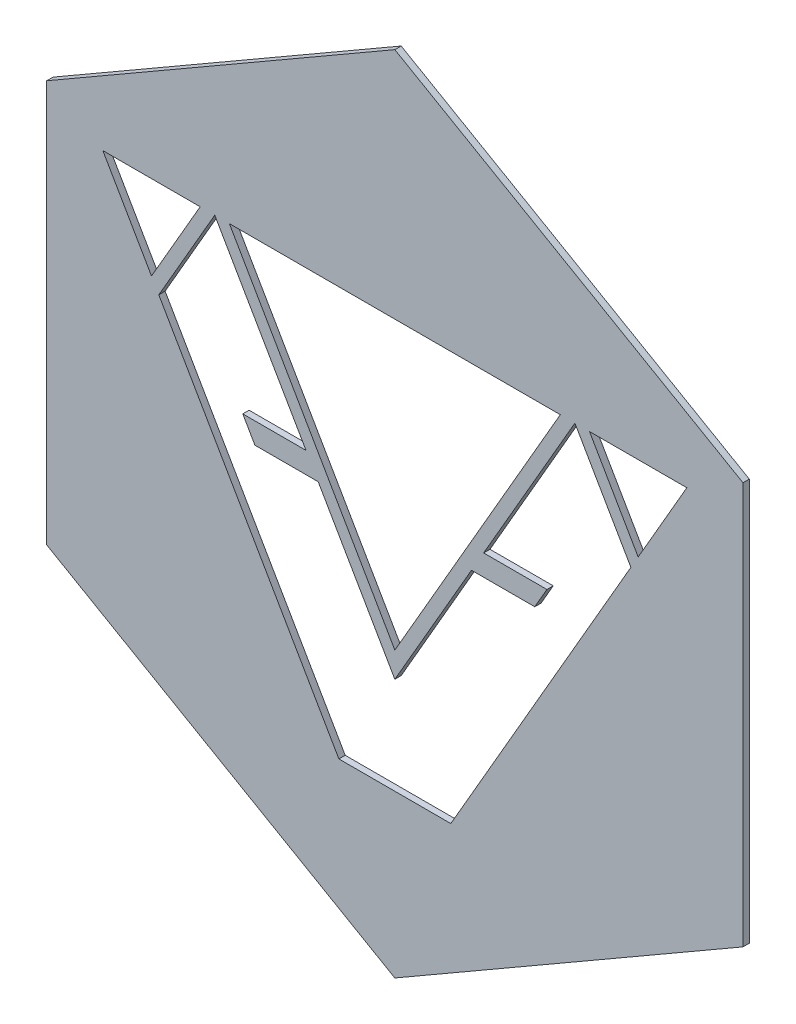
ISO-10303-21;
HEADER;
FILE_DESCRIPTION(('STEP AP214'),'2;1');
FILE_NAME('part.step','',(''),(''),'','','');
FILE_SCHEMA(('AUTOMOTIVE_DESIGN { 1 0 10303 214 1 1 1 1 }'));
ENDSEC;
DATA;
#1=APPLICATION_CONTEXT('core data for automotive mechanical design processes');
#2=APPLICATION_PROTOCOL_DEFINITION('international standard','automotive_design',2000,#1);
#3=PRODUCT_CONTEXT('',#1,'mechanical');
#4=PRODUCT('Part','Part','',(#3));
#5=PRODUCT_RELATED_PRODUCT_CATEGORY('part','',(#4));
#6=PRODUCT_DEFINITION_FORMATION('','',#4);
#7=PRODUCT_DEFINITION_CONTEXT('part definition',#1,'design');
#8=PRODUCT_DEFINITION('design','',#6,#7);
#9=PRODUCT_DEFINITION_SHAPE('','',#8);
#10=(LENGTH_UNIT() NAMED_UNIT(*) SI_UNIT(.MILLI.,.METRE.));
#11=(NAMED_UNIT(*) PLANE_ANGLE_UNIT() SI_UNIT($,.RADIAN.));
#12=(NAMED_UNIT(*) SI_UNIT($,.STERADIAN.) SOLID_ANGLE_UNIT());
#13=UNCERTAINTY_MEASURE_WITH_UNIT(LENGTH_MEASURE(1.E-05),#10,'distance_accuracy_value','');
#14=(GEOMETRIC_REPRESENTATION_CONTEXT(3) GLOBAL_UNCERTAINTY_ASSIGNED_CONTEXT((#13)) GLOBAL_UNIT_ASSIGNED_CONTEXT((#10,
#11,#12)) REPRESENTATION_CONTEXT('',''));
#15=CARTESIAN_POINT('',(0.,0.,0.));
#16=DIRECTION('',(0.,0.,1.));
#17=DIRECTION('',(1.,0.,0.));
#18=AXIS2_PLACEMENT_3D('',#15,#16,#17);
#19=CARTESIAN_POINT('',(0.,0.,0.));
#20=DIRECTION('',(0.,0.,1.));
#21=DIRECTION('',(1.,0.,0.));
#22=AXIS2_PLACEMENT_3D('',#19,#20,#21);
#23=PLANE('',#22);
#24=DIRECTION('',(0.5,-0.866025403784439,0.));
#25=VECTOR('',#24,1.);
#26=CARTESIAN_POINT('',(-13.0866061016315,13.3333333333333,0.));
#27=LINE('',#26,#25);
#28=CARTESIAN_POINT('',(-13.0866061016315,13.3333333333333,0.));
#29=VERTEX_POINT('',#28);
#30=CARTESIAN_POINT('',(0.,-9.33333333333341,0.));
#31=VERTEX_POINT('',#30);
#32=EDGE_CURVE('E471',#29,#31,#27,.T.);
#33=ORIENTED_EDGE('',*,*,#32,.T.);
#34=DIRECTION('',(0.5,0.866025403784438,0.));
#35=VECTOR('',#34,1.);
#36=CARTESIAN_POINT('',(0.,-9.33333333333341,0.));
#37=LINE('',#36,#35);
#38=CARTESIAN_POINT('',(13.0866061016316,13.3333333333333,0.));
#39=VERTEX_POINT('',#38);
#40=EDGE_CURVE('E468',#31,#39,#37,.T.);
#41=ORIENTED_EDGE('',*,*,#40,.T.);
#42=DIRECTION('',(-1.,0.,0.));
#43=VECTOR('',#42,1.);
#44=CARTESIAN_POINT('',(13.0866061016316,13.3333333333333,0.));
#45=LINE('',#44,#43);
#46=EDGE_CURVE('E424',#39,#29,#45,.T.);
#47=ORIENTED_EDGE('',*,*,#46,.T.);
#48=EDGE_LOOP('',(#33,#41,#47));
#49=FACE_BOUND('',#48,.T.);
#50=DIRECTION('',(0.500000000000005,0.866025403784436,0.));
#51=VECTOR('',#50,1.);
#52=CARTESIAN_POINT('',(19.2450089729876,6.66666666666645,0.));
#53=LINE('',#52,#51);
#54=CARTESIAN_POINT('',(19.2450089729876,6.66666666666645,0.));
#55=VERTEX_POINT('',#54);
#56=CARTESIAN_POINT('',(23.0940107675852,13.3333333333331,0.));
#57=VERTEX_POINT('',#56);
#58=EDGE_CURVE('E422',#55,#57,#53,.T.);
#59=ORIENTED_EDGE('',*,*,#58,.T.);
#60=DIRECTION('',(-1.,0.,0.));
#61=VECTOR('',#60,1.);
#62=CARTESIAN_POINT('',(23.0940107675852,13.3333333333331,0.));
#63=LINE('',#62,#61);
#64=CARTESIAN_POINT('',(15.39600717839,13.3333333333333,0.));
#65=VERTEX_POINT('',#64);
#66=EDGE_CURVE('E419',#57,#65,#63,.T.);
#67=ORIENTED_EDGE('',*,*,#66,.T.);
#68=DIRECTION('',(0.5,-0.866025403784439,0.));
#69=VECTOR('',#68,1.);
#70=CARTESIAN_POINT('',(15.39600717839,13.3333333333333,0.));
#71=LINE('',#70,#69);
#72=EDGE_CURVE('E415',#65,#55,#71,.T.);
#73=ORIENTED_EDGE('',*,*,#72,.T.);
#74=EDGE_LOOP('',(#59,#67,#73));
#75=FACE_BOUND('',#74,.T.);
#76=DIRECTION('',(0.,1.,0.));
#77=VECTOR('',#76,1.);
#78=CARTESIAN_POINT('',(27.5326920704511,-15.89600717839,0.));
#79=LINE('',#78,#77);
#80=CARTESIAN_POINT('',(27.5326920704511,-15.89600717839,0.));
#81=VERTEX_POINT('',#80);
#82=CARTESIAN_POINT('',(27.5326920704511,15.89600717839,0.));
#83=VERTEX_POINT('',#82);
#84=EDGE_CURVE('E224',#81,#83,#79,.T.);
#85=ORIENTED_EDGE('',*,*,#84,.F.);
#86=DIRECTION('',(0.866025403784439,0.5,0.));
#87=VECTOR('',#86,1.);
#88=CARTESIAN_POINT('',(0.,-31.79201435678,0.));
#89=LINE('',#88,#87);
#90=CARTESIAN_POINT('',(0.,-31.79201435678,0.));
#91=VERTEX_POINT('',#90);
#92=EDGE_CURVE('E220',#91,#81,#89,.T.);
#93=ORIENTED_EDGE('',*,*,#92,.F.);
#94=DIRECTION('',(0.866025403784439,-0.5,0.));
#95=VECTOR('',#94,1.);
#96=CARTESIAN_POINT('',(-27.5326920704511,-15.89600717839,0.));
#97=LINE('',#96,#95);
#98=CARTESIAN_POINT('',(-27.5326920704511,-15.89600717839,0.));
#99=VERTEX_POINT('',#98);
#100=EDGE_CURVE('E216',#99,#91,#97,.T.);
#101=ORIENTED_EDGE('',*,*,#100,.F.);
#102=DIRECTION('',(0.,-1.,0.));
#103=VECTOR('',#102,1.);
#104=CARTESIAN_POINT('',(-27.5326920704511,15.89600717839,0.));
#105=LINE('',#104,#103);
#106=CARTESIAN_POINT('',(-27.5326920704511,15.89600717839,0.));
#107=VERTEX_POINT('',#106);
#108=EDGE_CURVE('E212',#107,#99,#105,.T.);
#109=ORIENTED_EDGE('',*,*,#108,.F.);
#110=DIRECTION('',(-0.866025403784439,-0.5,0.));
#111=VECTOR('',#110,1.);
#112=CARTESIAN_POINT('',(0.,31.79201435678,0.));
#113=LINE('',#112,#111);
#114=CARTESIAN_POINT('',(0.,31.79201435678,0.));
#115=VERTEX_POINT('',#114);
#116=EDGE_CURVE('E208',#115,#107,#113,.T.);
#117=ORIENTED_EDGE('',*,*,#116,.F.);
#118=DIRECTION('',(-0.866025403784439,0.5,0.));
#119=VECTOR('',#118,1.);
#120=CARTESIAN_POINT('',(27.5326920704511,15.89600717839,0.));
#121=LINE('',#120,#119);
#122=EDGE_CURVE('E204',#83,#115,#121,.T.);
#123=ORIENTED_EDGE('',*,*,#122,.F.);
#124=EDGE_LOOP('',(#85,#93,#101,#109,#117,#123));
#125=FACE_BOUND('',#124,.T.);
#126=DIRECTION('',(1.,0.,0.));
#127=VECTOR('',#126,1.);
#128=CARTESIAN_POINT('',(-4.42635206378712,-19.,0.));
#129=LINE('',#128,#127);
#130=CARTESIAN_POINT('',(-4.42635206378712,-19.,0.));
#131=VERTEX_POINT('',#130);
#132=CARTESIAN_POINT('',(4.42635206378714,-19.,0.));
#133=VERTEX_POINT('',#132);
#134=EDGE_CURVE('E418',#131,#133,#129,.T.);
#135=ORIENTED_EDGE('',*,*,#134,.T.);
#136=DIRECTION('',(0.500000000000005,0.866025403784436,0.));
#137=VECTOR('',#136,1.);
#138=CARTESIAN_POINT('',(4.42635206378714,-19.,0.));
#139=LINE('',#138,#137);
#140=CARTESIAN_POINT('',(18.667658703798,5.66666666666648,0.));
#141=VERTEX_POINT('',#140);
#142=EDGE_CURVE('E461',#133,#141,#139,.T.);
#143=ORIENTED_EDGE('',*,*,#142,.T.);
#144=DIRECTION('',(-0.499999999999999,0.866025403784439,0.));
#145=VECTOR('',#144,1.);
#146=CARTESIAN_POINT('',(18.667658703798,5.66666666666648,0.));
#147=LINE('',#146,#145);
#148=CARTESIAN_POINT('',(14.2413066400108,13.3333333333333,0.));
#149=VERTEX_POINT('',#148);
#150=EDGE_CURVE('E458',#141,#149,#147,.T.);
#151=ORIENTED_EDGE('',*,*,#150,.T.);
#152=DIRECTION('',(-0.5,-0.866025403784439,0.));
#153=VECTOR('',#152,1.);
#154=CARTESIAN_POINT('',(14.2413066400108,13.3333333333333,0.));
#155=LINE('',#154,#153);
#156=CARTESIAN_POINT('',(7.02442827514044,0.833333333333337,0.));
#157=VERTEX_POINT('',#156);
#158=EDGE_CURVE('E455',#149,#157,#155,.T.);
#159=ORIENTED_EDGE('',*,*,#158,.T.);
#160=DIRECTION('',(1.,0.,0.));
#161=VECTOR('',#160,1.);
#162=CARTESIAN_POINT('',(7.02442827514044,0.833333333333337,0.));
#163=LINE('',#162,#161);
#164=CARTESIAN_POINT('',(12.0281306081172,0.833333333333334,0.));
#165=VERTEX_POINT('',#164);
#166=EDGE_CURVE('E452',#157,#165,#163,.T.);
#167=ORIENTED_EDGE('',*,*,#166,.T.);
#168=DIRECTION('',(-0.500000000000001,-0.866025403784438,0.));
#169=VECTOR('',#168,1.);
#170=CARTESIAN_POINT('',(12.0281306081172,0.833333333333334,0.));
#171=LINE('',#170,#169);
#172=CARTESIAN_POINT('',(11.0658801594679,-0.833333333333335,0.));
#173=VERTEX_POINT('',#172);
#174=EDGE_CURVE('E449',#165,#173,#171,.T.);
#175=ORIENTED_EDGE('',*,*,#174,.T.);
#176=DIRECTION('',(-1.,0.,0.));
#177=VECTOR('',#176,1.);
#178=CARTESIAN_POINT('',(11.0658801594679,-0.833333333333335,0.));
#179=LINE('',#178,#177);
#180=CARTESIAN_POINT('',(6.06217782649106,-0.833333333333335,0.));
#181=VERTEX_POINT('',#180);
#182=EDGE_CURVE('E446',#173,#181,#179,.T.);
#183=ORIENTED_EDGE('',*,*,#182,.T.);
#184=DIRECTION('',(-0.5,-0.866025403784439,0.));
#185=VECTOR('',#184,1.);
#186=CARTESIAN_POINT('',(6.06217782649106,-0.833333333333335,0.));
#187=LINE('',#186,#185);
#188=CARTESIAN_POINT('',(0.,-11.3333333333333,0.));
#189=VERTEX_POINT('',#188);
#190=EDGE_CURVE('E443',#181,#189,#187,.T.);
#191=ORIENTED_EDGE('',*,*,#190,.T.);
#192=DIRECTION('',(-0.499999999999999,0.866025403784439,0.));
#193=VECTOR('',#192,1.);
#194=CARTESIAN_POINT('',(0.,-11.3333333333333,0.));
#195=LINE('',#194,#193);
#196=CARTESIAN_POINT('',(-6.06217782649106,-0.833333333333333,0.));
#197=VERTEX_POINT('',#196);
#198=EDGE_CURVE('E440',#189,#197,#195,.T.);
#199=ORIENTED_EDGE('',*,*,#198,.T.);
#200=DIRECTION('',(-1.,0.,0.));
#201=VECTOR('',#200,1.);
#202=CARTESIAN_POINT('',(-6.06217782649106,-0.833333333333333,0.));
#203=LINE('',#202,#201);
#204=CARTESIAN_POINT('',(-11.0658801594678,-0.833333333333333,0.));
#205=VERTEX_POINT('',#204);
#206=EDGE_CURVE('E437',#197,#205,#203,.T.);
#207=ORIENTED_EDGE('',*,*,#206,.T.);
#208=DIRECTION('',(-0.499999999999999,0.866025403784439,0.));
#209=VECTOR('',#208,1.);
#210=CARTESIAN_POINT('',(-11.0658801594678,-0.833333333333333,0.));
#211=LINE('',#210,#209);
#212=CARTESIAN_POINT('',(-12.0281306081172,0.833333333333336,0.));
#213=VERTEX_POINT('',#212);
#214=EDGE_CURVE('E434',#205,#213,#211,.T.);
#215=ORIENTED_EDGE('',*,*,#214,.T.);
#216=DIRECTION('',(1.,0.,0.));
#217=VECTOR('',#216,1.);
#218=CARTESIAN_POINT('',(-12.0281306081172,0.833333333333336,0.));
#219=LINE('',#218,#217);
#220=CARTESIAN_POINT('',(-7.02442827514044,0.833333333333337,0.));
#221=VERTEX_POINT('',#220);
#222=EDGE_CURVE('E431',#213,#221,#219,.T.);
#223=ORIENTED_EDGE('',*,*,#222,.T.);
#224=DIRECTION('',(-0.499999999999999,0.866025403784439,0.));
#225=VECTOR('',#224,1.);
#226=CARTESIAN_POINT('',(-7.02442827514044,0.833333333333337,0.));
#227=LINE('',#226,#225);
#228=CARTESIAN_POINT('',(-14.2413066400107,13.3333333333333,0.));
#229=VERTEX_POINT('',#228);
#230=EDGE_CURVE('E428',#221,#229,#227,.T.);
#231=ORIENTED_EDGE('',*,*,#230,.T.);
#232=DIRECTION('',(-0.500000000000003,-0.866025403784437,0.));
#233=VECTOR('',#232,1.);
#234=CARTESIAN_POINT('',(-14.2413066400107,13.3333333333333,0.));
#235=LINE('',#234,#233);
#236=CARTESIAN_POINT('',(-18.6676587037979,5.66666666666675,0.));
#237=VERTEX_POINT('',#236);
#238=EDGE_CURVE('E195',#229,#237,#235,.T.);
#239=ORIENTED_EDGE('',*,*,#238,.T.);
#240=DIRECTION('',(0.499999999999998,-0.86602540378444,0.));
#241=VECTOR('',#240,1.);
#242=CARTESIAN_POINT('',(-18.6676587037979,5.66666666666675,0.));
#243=LINE('',#242,#241);
#244=EDGE_CURVE('E192',#237,#131,#243,.T.);
#245=ORIENTED_EDGE('',*,*,#244,.T.);
#246=EDGE_LOOP('',(#135,#143,#151,#159,#167,#175,#183,#191,#199,#207,#215,#223,#231,#239,#245));
#247=FACE_BOUND('',#246,.T.);
#248=DIRECTION('',(-1.,0.,0.));
#249=VECTOR('',#248,1.);
#250=CARTESIAN_POINT('',(-15.39600717839,13.3333333333333,0.));
#251=LINE('',#250,#249);
#252=CARTESIAN_POINT('',(-15.39600717839,13.3333333333333,0.));
#253=VERTEX_POINT('',#252);
#254=CARTESIAN_POINT('',(-23.094010767585,13.3333333333334,0.));
#255=VERTEX_POINT('',#254);
#256=EDGE_CURVE('E181',#253,#255,#251,.T.);
#257=ORIENTED_EDGE('',*,*,#256,.T.);
#258=DIRECTION('',(0.499999999999997,-0.86602540378444,0.));
#259=VECTOR('',#258,1.);
#260=CARTESIAN_POINT('',(-23.094010767585,13.3333333333334,0.));
#261=LINE('',#260,#259);
#262=CARTESIAN_POINT('',(-19.2450089729875,6.66666666666676,0.));
#263=VERTEX_POINT('',#262);
#264=EDGE_CURVE('E187',#255,#263,#261,.T.);
#265=ORIENTED_EDGE('',*,*,#264,.T.);
#266=DIRECTION('',(0.500000000000005,0.866025403784436,0.));
#267=VECTOR('',#266,1.);
#268=CARTESIAN_POINT('',(-19.2450089729875,6.66666666666676,0.));
#269=LINE('',#268,#267);
#270=EDGE_CURVE('E190',#263,#253,#269,.T.);
#271=ORIENTED_EDGE('',*,*,#270,.T.);
#272=EDGE_LOOP('',(#257,#265,#271));
#273=FACE_BOUND('',#272,.T.);
#274=ADVANCED_FACE('F33',(#49,#75,#125,#247,#273),#23,.F.);
#275=CARTESIAN_POINT('',(27.5326920704511,-15.89600717839,84.613763665835));
#276=DIRECTION('',(-1.,0.,0.));
#277=DIRECTION('',(0.,0.,1.));
#278=AXIS2_PLACEMENT_3D('',#275,#276,#277);
#279=PLANE('',#278);
#280=DIRECTION('',(0.,0.,-1.));
#281=VECTOR('',#280,1.);
#282=CARTESIAN_POINT('',(27.5326920704511,15.89600717839,84.613763665835));
#283=LINE('',#282,#281);
#284=CARTESIAN_POINT('',(27.5326920704511,15.89600717839,0.5));
#285=VERTEX_POINT('',#284);
#286=EDGE_CURVE('E202',#285,#83,#283,.T.);
#287=ORIENTED_EDGE('',*,*,#286,.F.);
#288=DIRECTION('',(0.,-1.,0.));
#289=VECTOR('',#288,1.);
#290=CARTESIAN_POINT('',(27.5326920704511,-15.89600717839,0.5));
#291=LINE('',#290,#289);
#292=CARTESIAN_POINT('',(27.5326920704511,-15.89600717839,0.5));
#293=VERTEX_POINT('',#292);
#294=EDGE_CURVE('E52',#285,#293,#291,.T.);
#295=ORIENTED_EDGE('',*,*,#294,.T.);
#296=DIRECTION('',(0.,0.,-1.));
#297=VECTOR('',#296,1.);
#298=CARTESIAN_POINT('',(27.5326920704511,-15.89600717839,84.613763665835));
#299=LINE('',#298,#297);
#300=EDGE_CURVE('E222',#293,#81,#299,.T.);
#301=ORIENTED_EDGE('',*,*,#300,.T.);
#302=ORIENTED_EDGE('',*,*,#84,.T.);
#303=EDGE_LOOP('',(#287,#295,#301,#302));
#304=FACE_BOUND('',#303,.T.);
#305=ADVANCED_FACE('F407',(#304),#279,.F.);
#306=CARTESIAN_POINT('',(27.5326920704511,15.89600717839,84.613763665835));
#307=DIRECTION('',(-0.5,-0.866025403784439,0.));
#308=DIRECTION('',(0.866025403784439,-0.5,0.));
#309=AXIS2_PLACEMENT_3D('',#306,#307,#308);
#310=PLANE('',#309);
#311=DIRECTION('',(0.,0.,-1.));
#312=VECTOR('',#311,1.);
#313=CARTESIAN_POINT('',(0.,31.79201435678,84.613763665835));
#314=LINE('',#313,#312);
#315=CARTESIAN_POINT('',(0.,31.79201435678,0.5));
#316=VERTEX_POINT('',#315);
#317=EDGE_CURVE('E206',#316,#115,#314,.T.);
#318=ORIENTED_EDGE('',*,*,#317,.F.);
#319=DIRECTION('',(0.866025403784439,-0.5,0.));
#320=VECTOR('',#319,1.);
#321=CARTESIAN_POINT('',(27.5326920704511,15.89600717839,0.5));
#322=LINE('',#321,#320);
#323=EDGE_CURVE('E205',#316,#285,#322,.T.);
#324=ORIENTED_EDGE('',*,*,#323,.T.);
#325=ORIENTED_EDGE('',*,*,#286,.T.);
#326=ORIENTED_EDGE('',*,*,#122,.T.);
#327=EDGE_LOOP('',(#318,#324,#325,#326));
#328=FACE_BOUND('',#327,.T.);
#329=ADVANCED_FACE('F383',(#328),#310,.F.);
#330=CARTESIAN_POINT('',(0.,31.79201435678,84.613763665835));
#331=DIRECTION('',(0.5,-0.866025403784439,0.));
#332=DIRECTION('',(0.866025403784439,0.5,0.));
#333=AXIS2_PLACEMENT_3D('',#330,#331,#332);
#334=PLANE('',#333);
#335=DIRECTION('',(0.,0.,-1.));
#336=VECTOR('',#335,1.);
#337=CARTESIAN_POINT('',(-27.5326920704511,15.89600717839,84.613763665835));
#338=LINE('',#337,#336);
#339=CARTESIAN_POINT('',(-27.5326920704511,15.89600717839,0.5));
#340=VERTEX_POINT('',#339);
#341=EDGE_CURVE('E210',#340,#107,#338,.T.);
#342=ORIENTED_EDGE('',*,*,#341,.F.);
#343=DIRECTION('',(0.866025403784439,0.5,0.));
#344=VECTOR('',#343,1.);
#345=CARTESIAN_POINT('',(0.,31.79201435678,0.5));
#346=LINE('',#345,#344);
#347=EDGE_CURVE('E209',#340,#316,#346,.T.);
#348=ORIENTED_EDGE('',*,*,#347,.T.);
#349=ORIENTED_EDGE('',*,*,#317,.T.);
#350=ORIENTED_EDGE('',*,*,#116,.T.);
#351=EDGE_LOOP('',(#342,#348,#349,#350));
#352=FACE_BOUND('',#351,.T.);
#353=ADVANCED_FACE('F388',(#352),#334,.F.);
#354=CARTESIAN_POINT('',(-27.5326920704511,15.89600717839,84.613763665835));
#355=DIRECTION('',(1.,0.,0.));
#356=DIRECTION('',(0.,1.,0.));
#357=AXIS2_PLACEMENT_3D('',#354,#355,#356);
#358=PLANE('',#357);
#359=DIRECTION('',(0.,0.,-1.));
#360=VECTOR('',#359,1.);
#361=CARTESIAN_POINT('',(-27.5326920704511,-15.89600717839,84.613763665835));
#362=LINE('',#361,#360);
#363=CARTESIAN_POINT('',(-27.5326920704511,-15.89600717839,0.5));
#364=VERTEX_POINT('',#363);
#365=EDGE_CURVE('E214',#364,#99,#362,.T.);
#366=ORIENTED_EDGE('',*,*,#365,.F.);
#367=DIRECTION('',(0.,1.,0.));
#368=VECTOR('',#367,1.);
#369=CARTESIAN_POINT('',(-27.5326920704511,15.89600717839,0.5));
#370=LINE('',#369,#368);
#371=EDGE_CURVE('E213',#364,#340,#370,.T.);
#372=ORIENTED_EDGE('',*,*,#371,.T.);
#373=ORIENTED_EDGE('',*,*,#341,.T.);
#374=ORIENTED_EDGE('',*,*,#108,.T.);
#375=EDGE_LOOP('',(#366,#372,#373,#374));
#376=FACE_BOUND('',#375,.T.);
#377=ADVANCED_FACE('F393',(#376),#358,.F.);
#378=CARTESIAN_POINT('',(-27.5326920704511,-15.89600717839,84.613763665835));
#379=DIRECTION('',(0.5,0.866025403784439,0.));
#380=DIRECTION('',(-0.866025403784439,0.5,0.));
#381=AXIS2_PLACEMENT_3D('',#378,#379,#380);
#382=PLANE('',#381);
#383=DIRECTION('',(0.,0.,-1.));
#384=VECTOR('',#383,1.);
#385=CARTESIAN_POINT('',(0.,-31.79201435678,84.613763665835));
#386=LINE('',#385,#384);
#387=CARTESIAN_POINT('',(0.,-31.79201435678,0.5));
#388=VERTEX_POINT('',#387);
#389=EDGE_CURVE('E218',#388,#91,#386,.T.);
#390=ORIENTED_EDGE('',*,*,#389,.F.);
#391=DIRECTION('',(-0.866025403784439,0.5,0.));
#392=VECTOR('',#391,1.);
#393=CARTESIAN_POINT('',(-27.5326920704511,-15.89600717839,0.5));
#394=LINE('',#393,#392);
#395=EDGE_CURVE('E217',#388,#364,#394,.T.);
#396=ORIENTED_EDGE('',*,*,#395,.T.);
#397=ORIENTED_EDGE('',*,*,#365,.T.);
#398=ORIENTED_EDGE('',*,*,#100,.T.);
#399=EDGE_LOOP('',(#390,#396,#397,#398));
#400=FACE_BOUND('',#399,.T.);
#401=ADVANCED_FACE('F397',(#400),#382,.F.);
#402=CARTESIAN_POINT('',(0.,-31.79201435678,84.613763665835));
#403=DIRECTION('',(-0.5,0.866025403784439,0.));
#404=DIRECTION('',(-0.866025403784439,-0.5,0.));
#405=AXIS2_PLACEMENT_3D('',#402,#403,#404);
#406=PLANE('',#405);
#407=ORIENTED_EDGE('',*,*,#300,.F.);
#408=DIRECTION('',(-0.866025403784439,-0.5,0.));
#409=VECTOR('',#408,1.);
#410=CARTESIAN_POINT('',(0.,-31.79201435678,0.5));
#411=LINE('',#410,#409);
#412=EDGE_CURVE('E221',#293,#388,#411,.T.);
#413=ORIENTED_EDGE('',*,*,#412,.T.);
#414=ORIENTED_EDGE('',*,*,#389,.T.);
#415=ORIENTED_EDGE('',*,*,#92,.T.);
#416=EDGE_LOOP('',(#407,#413,#414,#415));
#417=FACE_BOUND('',#416,.T.);
#418=ADVANCED_FACE('F403',(#417),#406,.F.);
#419=CARTESIAN_POINT('',(19.2450089729876,6.66666666666645,84.613763665835));
#420=DIRECTION('',(-0.866025403784436,0.500000000000005,0.));
#421=DIRECTION('',(-0.500000000000005,-0.866025403784436,0.));
#422=AXIS2_PLACEMENT_3D('',#419,#420,#421);
#423=PLANE('',#422);
#424=DIRECTION('',(-0.500000000000005,-0.866025403784436,0.));
#425=VECTOR('',#424,1.);
#426=CARTESIAN_POINT('',(19.2450089729876,6.66666666666645,0.5));
#427=LINE('',#426,#425);
#428=CARTESIAN_POINT('',(23.0940107675852,13.3333333333331,0.5));
#429=VERTEX_POINT('',#428);
#430=CARTESIAN_POINT('',(19.2450089729876,6.66666666666645,0.5));
#431=VERTEX_POINT('',#430);
#432=EDGE_CURVE('E280',#429,#431,#427,.T.);
#433=ORIENTED_EDGE('',*,*,#432,.F.);
#434=DIRECTION('',(0.,0.,-1.));
#435=VECTOR('',#434,1.);
#436=CARTESIAN_POINT('',(23.0940107675852,13.3333333333331,84.613763665835));
#437=LINE('',#436,#435);
#438=EDGE_CURVE('E225',#429,#57,#437,.T.);
#439=ORIENTED_EDGE('',*,*,#438,.T.);
#440=ORIENTED_EDGE('',*,*,#58,.F.);
#441=DIRECTION('',(0.,0.,-1.));
#442=VECTOR('',#441,1.);
#443=CARTESIAN_POINT('',(19.2450089729876,6.66666666666645,84.613763665835));
#444=LINE('',#443,#442);
#445=EDGE_CURVE('E229',#431,#55,#444,.T.);
#446=ORIENTED_EDGE('',*,*,#445,.F.);
#447=EDGE_LOOP('',(#433,#439,#440,#446));
#448=FACE_BOUND('',#447,.T.);
#449=ADVANCED_FACE('F502',(#448),#423,.T.);
#450=CARTESIAN_POINT('',(23.0940107675852,13.3333333333331,84.613763665835));
#451=DIRECTION('',(0.,-1.,0.));
#452=DIRECTION('',(1.,0.,0.));
#453=AXIS2_PLACEMENT_3D('',#450,#451,#452);
#454=PLANE('',#453);
#455=DIRECTION('',(1.,0.,0.));
#456=VECTOR('',#455,1.);
#457=CARTESIAN_POINT('',(23.0940107675852,13.3333333333331,0.5));
#458=LINE('',#457,#456);
#459=CARTESIAN_POINT('',(15.39600717839,13.3333333333333,0.5));
#460=VERTEX_POINT('',#459);
#461=EDGE_CURVE('E11',#460,#429,#458,.T.);
#462=ORIENTED_EDGE('',*,*,#461,.F.);
#463=DIRECTION('',(0.,0.,-1.));
#464=VECTOR('',#463,1.);
#465=CARTESIAN_POINT('',(15.39600717839,13.3333333333333,84.613763665835));
#466=LINE('',#465,#464);
#467=EDGE_CURVE('E227',#460,#65,#466,.T.);
#468=ORIENTED_EDGE('',*,*,#467,.T.);
#469=ORIENTED_EDGE('',*,*,#66,.F.);
#470=ORIENTED_EDGE('',*,*,#438,.F.);
#471=EDGE_LOOP('',(#462,#468,#469,#470));
#472=FACE_BOUND('',#471,.T.);
#473=ADVANCED_FACE('F509',(#472),#454,.T.);
#474=CARTESIAN_POINT('',(15.39600717839,13.3333333333333,84.613763665835));
#475=DIRECTION('',(0.866025403784439,0.5,0.));
#476=DIRECTION('',(-0.5,0.866025403784439,0.));
#477=AXIS2_PLACEMENT_3D('',#474,#475,#476);
#478=PLANE('',#477);
#479=DIRECTION('',(-0.5,0.866025403784439,0.));
#480=VECTOR('',#479,1.);
#481=CARTESIAN_POINT('',(15.39600717839,13.3333333333333,0.5));
#482=LINE('',#481,#480);
#483=EDGE_CURVE('E43',#431,#460,#482,.T.);
#484=ORIENTED_EDGE('',*,*,#483,.F.);
#485=ORIENTED_EDGE('',*,*,#445,.T.);
#486=ORIENTED_EDGE('',*,*,#72,.F.);
#487=ORIENTED_EDGE('',*,*,#467,.F.);
#488=EDGE_LOOP('',(#484,#485,#486,#487));
#489=FACE_BOUND('',#488,.T.);
#490=ADVANCED_FACE('F506',(#489),#478,.T.);
#491=CARTESIAN_POINT('',(-4.42635206378712,-19.,84.613763665835));
#492=DIRECTION('',(0.,1.,0.));
#493=DIRECTION('',(-1.,0.,0.));
#494=AXIS2_PLACEMENT_3D('',#491,#492,#493);
#495=PLANE('',#494);
#496=DIRECTION('',(-1.,0.,0.));
#497=VECTOR('',#496,1.);
#498=CARTESIAN_POINT('',(-4.42635206378712,-19.,0.5));
#499=LINE('',#498,#497);
#500=CARTESIAN_POINT('',(4.42635206378714,-19.,0.5));
#501=VERTEX_POINT('',#500);
#502=CARTESIAN_POINT('',(-4.42635206378712,-19.,0.5));
#503=VERTEX_POINT('',#502);
#504=EDGE_CURVE('E285',#501,#503,#499,.T.);
#505=ORIENTED_EDGE('',*,*,#504,.F.);
#506=DIRECTION('',(0.,0.,-1.));
#507=VECTOR('',#506,1.);
#508=CARTESIAN_POINT('',(4.42635206378714,-19.,84.613763665835));
#509=LINE('',#508,#507);
#510=EDGE_CURVE('E231',#501,#133,#509,.T.);
#511=ORIENTED_EDGE('',*,*,#510,.T.);
#512=ORIENTED_EDGE('',*,*,#134,.F.);
#513=DIRECTION('',(0.,0.,-1.));
#514=VECTOR('',#513,1.);
#515=CARTESIAN_POINT('',(-4.42635206378712,-19.,84.613763665835));
#516=LINE('',#515,#514);
#517=EDGE_CURVE('E259',#503,#131,#516,.T.);
#518=ORIENTED_EDGE('',*,*,#517,.F.);
#519=EDGE_LOOP('',(#505,#511,#512,#518));
#520=FACE_BOUND('',#519,.T.);
#521=ADVANCED_FACE('F578',(#520),#495,.T.);
#522=CARTESIAN_POINT('',(4.42635206378714,-19.,84.613763665835));
#523=DIRECTION('',(-0.866025403784436,0.500000000000005,0.));
#524=DIRECTION('',(-0.500000000000005,-0.866025403784436,0.));
#525=AXIS2_PLACEMENT_3D('',#522,#523,#524);
#526=PLANE('',#525);
#527=DIRECTION('',(-0.500000000000005,-0.866025403784436,0.));
#528=VECTOR('',#527,1.);
#529=CARTESIAN_POINT('',(4.42635206378714,-19.,0.5));
#530=LINE('',#529,#528);
#531=CARTESIAN_POINT('',(18.667658703798,5.66666666666648,0.5));
#532=VERTEX_POINT('',#531);
#533=EDGE_CURVE('E281',#532,#501,#530,.T.);
#534=ORIENTED_EDGE('',*,*,#533,.F.);
#535=DIRECTION('',(0.,0.,-1.));
#536=VECTOR('',#535,1.);
#537=CARTESIAN_POINT('',(18.667658703798,5.66666666666648,84.613763665835));
#538=LINE('',#537,#536);
#539=EDGE_CURVE('E233',#532,#141,#538,.T.);
#540=ORIENTED_EDGE('',*,*,#539,.T.);
#541=ORIENTED_EDGE('',*,*,#142,.F.);
#542=ORIENTED_EDGE('',*,*,#510,.F.);
#543=EDGE_LOOP('',(#534,#540,#541,#542));
#544=FACE_BOUND('',#543,.T.);
#545=ADVANCED_FACE('F574',(#544),#526,.T.);
#546=CARTESIAN_POINT('',(18.667658703798,5.66666666666648,84.613763665835));
#547=DIRECTION('',(-0.866025403784439,-0.499999999999999,0.));
#548=DIRECTION('',(0.499999999999999,-0.866025403784439,0.));
#549=AXIS2_PLACEMENT_3D('',#546,#547,#548);
#550=PLANE('',#549);
#551=DIRECTION('',(0.499999999999999,-0.866025403784439,0.));
#552=VECTOR('',#551,1.);
#553=CARTESIAN_POINT('',(18.667658703798,5.66666666666648,0.5));
#554=LINE('',#553,#552);
#555=CARTESIAN_POINT('',(14.2413066400108,13.3333333333333,0.5));
#556=VERTEX_POINT('',#555);
#557=EDGE_CURVE('E291',#556,#532,#554,.T.);
#558=ORIENTED_EDGE('',*,*,#557,.F.);
#559=DIRECTION('',(0.,0.,-1.));
#560=VECTOR('',#559,1.);
#561=CARTESIAN_POINT('',(14.2413066400108,13.3333333333333,84.613763665835));
#562=LINE('',#561,#560);
#563=EDGE_CURVE('E235',#556,#149,#562,.T.);
#564=ORIENTED_EDGE('',*,*,#563,.T.);
#565=ORIENTED_EDGE('',*,*,#150,.F.);
#566=ORIENTED_EDGE('',*,*,#539,.F.);
#567=EDGE_LOOP('',(#558,#564,#565,#566));
#568=FACE_BOUND('',#567,.T.);
#569=ADVANCED_FACE('F570',(#568),#550,.T.);
#570=CARTESIAN_POINT('',(14.2413066400108,13.3333333333333,84.613763665835));
#571=DIRECTION('',(0.866025403784438,-0.5,0.));
#572=DIRECTION('',(0.5,0.866025403784439,0.));
#573=AXIS2_PLACEMENT_3D('',#570,#571,#572);
#574=PLANE('',#573);
#575=DIRECTION('',(0.5,0.866025403784439,0.));
#576=VECTOR('',#575,1.);
#577=CARTESIAN_POINT('',(14.2413066400108,13.3333333333333,0.5));
#578=LINE('',#577,#576);
#579=CARTESIAN_POINT('',(7.02442827514044,0.833333333333337,0.5));
#580=VERTEX_POINT('',#579);
#581=EDGE_CURVE('E294',#580,#556,#578,.T.);
#582=ORIENTED_EDGE('',*,*,#581,.F.);
#583=DIRECTION('',(0.,0.,-1.));
#584=VECTOR('',#583,1.);
#585=CARTESIAN_POINT('',(7.02442827514044,0.833333333333337,84.613763665835));
#586=LINE('',#585,#584);
#587=EDGE_CURVE('E237',#580,#157,#586,.T.);
#588=ORIENTED_EDGE('',*,*,#587,.T.);
#589=ORIENTED_EDGE('',*,*,#158,.F.);
#590=ORIENTED_EDGE('',*,*,#563,.F.);
#591=EDGE_LOOP('',(#582,#588,#589,#590));
#592=FACE_BOUND('',#591,.T.);
#593=ADVANCED_FACE('F566',(#592),#574,.T.);
#594=CARTESIAN_POINT('',(7.02442827514044,0.833333333333337,84.613763665835));
#595=DIRECTION('',(0.,1.,0.));
#596=DIRECTION('',(-1.,0.,0.));
#597=AXIS2_PLACEMENT_3D('',#594,#595,#596);
#598=PLANE('',#597);
#599=DIRECTION('',(-1.,0.,0.));
#600=VECTOR('',#599,1.);
#601=CARTESIAN_POINT('',(7.02442827514044,0.833333333333337,0.5));
#602=LINE('',#601,#600);
#603=CARTESIAN_POINT('',(12.0281306081172,0.833333333333334,0.5));
#604=VERTEX_POINT('',#603);
#605=EDGE_CURVE('E297',#604,#580,#602,.T.);
#606=ORIENTED_EDGE('',*,*,#605,.F.);
#607=DIRECTION('',(0.,0.,-1.));
#608=VECTOR('',#607,1.);
#609=CARTESIAN_POINT('',(12.0281306081172,0.833333333333334,84.613763665835));
#610=LINE('',#609,#608);
#611=EDGE_CURVE('E239',#604,#165,#610,.T.);
#612=ORIENTED_EDGE('',*,*,#611,.T.);
#613=ORIENTED_EDGE('',*,*,#166,.F.);
#614=ORIENTED_EDGE('',*,*,#587,.F.);
#615=EDGE_LOOP('',(#606,#612,#613,#614));
#616=FACE_BOUND('',#615,.T.);
#617=ADVANCED_FACE('F562',(#616),#598,.T.);
#618=CARTESIAN_POINT('',(12.0281306081172,0.833333333333334,84.613763665835));
#619=DIRECTION('',(0.866025403784438,-0.500000000000001,0.));
#620=DIRECTION('',(0.500000000000001,0.866025403784438,0.));
#621=AXIS2_PLACEMENT_3D('',#618,#619,#620);
#622=PLANE('',#621);
#623=DIRECTION('',(0.500000000000001,0.866025403784438,0.));
#624=VECTOR('',#623,1.);
#625=CARTESIAN_POINT('',(12.0281306081172,0.833333333333334,0.5));
#626=LINE('',#625,#624);
#627=CARTESIAN_POINT('',(11.0658801594679,-0.833333333333335,0.5));
#628=VERTEX_POINT('',#627);
#629=EDGE_CURVE('E300',#628,#604,#626,.T.);
#630=ORIENTED_EDGE('',*,*,#629,.F.);
#631=DIRECTION('',(0.,0.,-1.));
#632=VECTOR('',#631,1.);
#633=CARTESIAN_POINT('',(11.0658801594679,-0.833333333333335,84.613763665835));
#634=LINE('',#633,#632);
#635=EDGE_CURVE('E241',#628,#173,#634,.T.);
#636=ORIENTED_EDGE('',*,*,#635,.T.);
#637=ORIENTED_EDGE('',*,*,#174,.F.);
#638=ORIENTED_EDGE('',*,*,#611,.F.);
#639=EDGE_LOOP('',(#630,#636,#637,#638));
#640=FACE_BOUND('',#639,.T.);
#641=ADVANCED_FACE('F558',(#640),#622,.T.);
#642=CARTESIAN_POINT('',(11.0658801594679,-0.833333333333335,84.613763665835));
#643=DIRECTION('',(0.,-1.,0.));
#644=DIRECTION('',(1.,0.,0.));
#645=AXIS2_PLACEMENT_3D('',#642,#643,#644);
#646=PLANE('',#645);
#647=DIRECTION('',(1.,0.,0.));
#648=VECTOR('',#647,1.);
#649=CARTESIAN_POINT('',(11.0658801594679,-0.833333333333335,0.5));
#650=LINE('',#649,#648);
#651=CARTESIAN_POINT('',(6.06217782649106,-0.833333333333335,0.5));
#652=VERTEX_POINT('',#651);
#653=EDGE_CURVE('E303',#652,#628,#650,.T.);
#654=ORIENTED_EDGE('',*,*,#653,.F.);
#655=DIRECTION('',(0.,0.,-1.));
#656=VECTOR('',#655,1.);
#657=CARTESIAN_POINT('',(6.06217782649106,-0.833333333333335,84.613763665835));
#658=LINE('',#657,#656);
#659=EDGE_CURVE('E243',#652,#181,#658,.T.);
#660=ORIENTED_EDGE('',*,*,#659,.T.);
#661=ORIENTED_EDGE('',*,*,#182,.F.);
#662=ORIENTED_EDGE('',*,*,#635,.F.);
#663=EDGE_LOOP('',(#654,#660,#661,#662));
#664=FACE_BOUND('',#663,.T.);
#665=ADVANCED_FACE('F554',(#664),#646,.T.);
#666=CARTESIAN_POINT('',(6.06217782649106,-0.833333333333335,84.613763665835));
#667=DIRECTION('',(0.866025403784439,-0.5,0.));
#668=DIRECTION('',(0.5,0.866025403784439,0.));
#669=AXIS2_PLACEMENT_3D('',#666,#667,#668);
#670=PLANE('',#669);
#671=DIRECTION('',(0.5,0.866025403784439,0.));
#672=VECTOR('',#671,1.);
#673=CARTESIAN_POINT('',(6.06217782649106,-0.833333333333335,0.5));
#674=LINE('',#673,#672);
#675=CARTESIAN_POINT('',(0.,-11.3333333333333,0.5));
#676=VERTEX_POINT('',#675);
#677=EDGE_CURVE('E306',#676,#652,#674,.T.);
#678=ORIENTED_EDGE('',*,*,#677,.F.);
#679=DIRECTION('',(0.,0.,-1.));
#680=VECTOR('',#679,1.);
#681=CARTESIAN_POINT('',(0.,-11.3333333333333,84.613763665835));
#682=LINE('',#681,#680);
#683=EDGE_CURVE('E245',#676,#189,#682,.T.);
#684=ORIENTED_EDGE('',*,*,#683,.T.);
#685=ORIENTED_EDGE('',*,*,#190,.F.);
#686=ORIENTED_EDGE('',*,*,#659,.F.);
#687=EDGE_LOOP('',(#678,#684,#685,#686));
#688=FACE_BOUND('',#687,.T.);
#689=ADVANCED_FACE('F550',(#688),#670,.T.);
#690=CARTESIAN_POINT('',(0.,-11.3333333333333,84.613763665835));
#691=DIRECTION('',(-0.866025403784439,-0.499999999999999,0.));
#692=DIRECTION('',(0.499999999999999,-0.866025403784439,0.));
#693=AXIS2_PLACEMENT_3D('',#690,#691,#692);
#694=PLANE('',#693);
#695=DIRECTION('',(0.499999999999999,-0.866025403784439,0.));
#696=VECTOR('',#695,1.);
#697=CARTESIAN_POINT('',(0.,-11.3333333333333,0.5));
#698=LINE('',#697,#696);
#699=CARTESIAN_POINT('',(-6.06217782649106,-0.833333333333333,0.5));
#700=VERTEX_POINT('',#699);
#701=EDGE_CURVE('E309',#700,#676,#698,.T.);
#702=ORIENTED_EDGE('',*,*,#701,.F.);
#703=DIRECTION('',(0.,0.,-1.));
#704=VECTOR('',#703,1.);
#705=CARTESIAN_POINT('',(-6.06217782649106,-0.833333333333333,84.613763665835));
#706=LINE('',#705,#704);
#707=EDGE_CURVE('E247',#700,#197,#706,.T.);
#708=ORIENTED_EDGE('',*,*,#707,.T.);
#709=ORIENTED_EDGE('',*,*,#198,.F.);
#710=ORIENTED_EDGE('',*,*,#683,.F.);
#711=EDGE_LOOP('',(#702,#708,#709,#710));
#712=FACE_BOUND('',#711,.T.);
#713=ADVANCED_FACE('F546',(#712),#694,.T.);
#714=CARTESIAN_POINT('',(-6.06217782649106,-0.833333333333333,84.613763665835));
#715=DIRECTION('',(0.,-1.,0.));
#716=DIRECTION('',(1.,0.,0.));
#717=AXIS2_PLACEMENT_3D('',#714,#715,#716);
#718=PLANE('',#717);
#719=DIRECTION('',(1.,0.,0.));
#720=VECTOR('',#719,1.);
#721=CARTESIAN_POINT('',(-6.06217782649106,-0.833333333333333,0.5));
#722=LINE('',#721,#720);
#723=CARTESIAN_POINT('',(-11.0658801594678,-0.833333333333333,0.5));
#724=VERTEX_POINT('',#723);
#725=EDGE_CURVE('E312',#724,#700,#722,.T.);
#726=ORIENTED_EDGE('',*,*,#725,.F.);
#727=DIRECTION('',(0.,0.,-1.));
#728=VECTOR('',#727,1.);
#729=CARTESIAN_POINT('',(-11.0658801594678,-0.833333333333333,84.613763665835));
#730=LINE('',#729,#728);
#731=EDGE_CURVE('E249',#724,#205,#730,.T.);
#732=ORIENTED_EDGE('',*,*,#731,.T.);
#733=ORIENTED_EDGE('',*,*,#206,.F.);
#734=ORIENTED_EDGE('',*,*,#707,.F.);
#735=EDGE_LOOP('',(#726,#732,#733,#734));
#736=FACE_BOUND('',#735,.T.);
#737=ADVANCED_FACE('F542',(#736),#718,.T.);
#738=CARTESIAN_POINT('',(-11.0658801594678,-0.833333333333333,84.613763665835));
#739=DIRECTION('',(-0.866025403784439,-0.499999999999999,0.));
#740=DIRECTION('',(0.499999999999999,-0.866025403784439,0.));
#741=AXIS2_PLACEMENT_3D('',#738,#739,#740);
#742=PLANE('',#741);
#743=DIRECTION('',(0.499999999999999,-0.866025403784439,0.));
#744=VECTOR('',#743,1.);
#745=CARTESIAN_POINT('',(-11.0658801594678,-0.833333333333333,0.5));
#746=LINE('',#745,#744);
#747=CARTESIAN_POINT('',(-12.0281306081172,0.833333333333336,0.5));
#748=VERTEX_POINT('',#747);
#749=EDGE_CURVE('E315',#748,#724,#746,.T.);
#750=ORIENTED_EDGE('',*,*,#749,.F.);
#751=DIRECTION('',(0.,0.,-1.));
#752=VECTOR('',#751,1.);
#753=CARTESIAN_POINT('',(-12.0281306081172,0.833333333333336,84.613763665835));
#754=LINE('',#753,#752);
#755=EDGE_CURVE('E251',#748,#213,#754,.T.);
#756=ORIENTED_EDGE('',*,*,#755,.T.);
#757=ORIENTED_EDGE('',*,*,#214,.F.);
#758=ORIENTED_EDGE('',*,*,#731,.F.);
#759=EDGE_LOOP('',(#750,#756,#757,#758));
#760=FACE_BOUND('',#759,.T.);
#761=ADVANCED_FACE('F538',(#760),#742,.T.);
#762=CARTESIAN_POINT('',(-12.0281306081172,0.833333333333336,84.613763665835));
#763=DIRECTION('',(0.,1.,0.));
#764=DIRECTION('',(-1.,0.,0.));
#765=AXIS2_PLACEMENT_3D('',#762,#763,#764);
#766=PLANE('',#765);
#767=DIRECTION('',(-1.,0.,0.));
#768=VECTOR('',#767,1.);
#769=CARTESIAN_POINT('',(-12.0281306081172,0.833333333333336,0.5));
#770=LINE('',#769,#768);
#771=CARTESIAN_POINT('',(-7.02442827514044,0.833333333333337,0.5));
#772=VERTEX_POINT('',#771);
#773=EDGE_CURVE('E318',#772,#748,#770,.T.);
#774=ORIENTED_EDGE('',*,*,#773,.F.);
#775=DIRECTION('',(0.,0.,-1.));
#776=VECTOR('',#775,1.);
#777=CARTESIAN_POINT('',(-7.02442827514044,0.833333333333337,84.613763665835));
#778=LINE('',#777,#776);
#779=EDGE_CURVE('E253',#772,#221,#778,.T.);
#780=ORIENTED_EDGE('',*,*,#779,.T.);
#781=ORIENTED_EDGE('',*,*,#222,.F.);
#782=ORIENTED_EDGE('',*,*,#755,.F.);
#783=EDGE_LOOP('',(#774,#780,#781,#782));
#784=FACE_BOUND('',#783,.T.);
#785=ADVANCED_FACE('F534',(#784),#766,.T.);
#786=CARTESIAN_POINT('',(-7.02442827514044,0.833333333333337,84.613763665835));
#787=DIRECTION('',(-0.866025403784439,-0.499999999999999,0.));
#788=DIRECTION('',(0.499999999999999,-0.866025403784439,0.));
#789=AXIS2_PLACEMENT_3D('',#786,#787,#788);
#790=PLANE('',#789);
#791=DIRECTION('',(0.499999999999999,-0.866025403784439,0.));
#792=VECTOR('',#791,1.);
#793=CARTESIAN_POINT('',(-7.02442827514044,0.833333333333337,0.5));
#794=LINE('',#793,#792);
#795=CARTESIAN_POINT('',(-14.2413066400107,13.3333333333333,0.5));
#796=VERTEX_POINT('',#795);
#797=EDGE_CURVE('E321',#796,#772,#794,.T.);
#798=ORIENTED_EDGE('',*,*,#797,.F.);
#799=DIRECTION('',(0.,0.,-1.));
#800=VECTOR('',#799,1.);
#801=CARTESIAN_POINT('',(-14.2413066400107,13.3333333333333,84.613763665835));
#802=LINE('',#801,#800);
#803=EDGE_CURVE('E255',#796,#229,#802,.T.);
#804=ORIENTED_EDGE('',*,*,#803,.T.);
#805=ORIENTED_EDGE('',*,*,#230,.F.);
#806=ORIENTED_EDGE('',*,*,#779,.F.);
#807=EDGE_LOOP('',(#798,#804,#805,#806));
#808=FACE_BOUND('',#807,.T.);
#809=ADVANCED_FACE('F530',(#808),#790,.T.);
#810=CARTESIAN_POINT('',(-14.2413066400107,13.3333333333333,84.613763665835));
#811=DIRECTION('',(0.866025403784437,-0.500000000000003,0.));
#812=DIRECTION('',(0.500000000000003,0.866025403784437,0.));
#813=AXIS2_PLACEMENT_3D('',#810,#811,#812);
#814=PLANE('',#813);
#815=DIRECTION('',(0.500000000000003,0.866025403784437,0.));
#816=VECTOR('',#815,1.);
#817=CARTESIAN_POINT('',(-14.2413066400107,13.3333333333333,0.5));
#818=LINE('',#817,#816);
#819=CARTESIAN_POINT('',(-18.6676587037979,5.66666666666675,0.5));
#820=VERTEX_POINT('',#819);
#821=EDGE_CURVE('E324',#820,#796,#818,.T.);
#822=ORIENTED_EDGE('',*,*,#821,.F.);
#823=DIRECTION('',(0.,0.,-1.));
#824=VECTOR('',#823,1.);
#825=CARTESIAN_POINT('',(-18.6676587037979,5.66666666666675,84.613763665835));
#826=LINE('',#825,#824);
#827=EDGE_CURVE('E257',#820,#237,#826,.T.);
#828=ORIENTED_EDGE('',*,*,#827,.T.);
#829=ORIENTED_EDGE('',*,*,#238,.F.);
#830=ORIENTED_EDGE('',*,*,#803,.F.);
#831=EDGE_LOOP('',(#822,#828,#829,#830));
#832=FACE_BOUND('',#831,.T.);
#833=ADVANCED_FACE('F526',(#832),#814,.T.);
#834=CARTESIAN_POINT('',(-18.6676587037979,5.66666666666675,84.613763665835));
#835=DIRECTION('',(0.86602540378444,0.499999999999998,0.));
#836=DIRECTION('',(-0.499999999999998,0.86602540378444,0.));
#837=AXIS2_PLACEMENT_3D('',#834,#835,#836);
#838=PLANE('',#837);
#839=DIRECTION('',(-0.499999999999998,0.86602540378444,0.));
#840=VECTOR('',#839,1.);
#841=CARTESIAN_POINT('',(-18.6676587037979,5.66666666666675,0.5));
#842=LINE('',#841,#840);
#843=EDGE_CURVE('E287',#503,#820,#842,.T.);
#844=ORIENTED_EDGE('',*,*,#843,.F.);
#845=ORIENTED_EDGE('',*,*,#517,.T.);
#846=ORIENTED_EDGE('',*,*,#244,.F.);
#847=ORIENTED_EDGE('',*,*,#827,.F.);
#848=EDGE_LOOP('',(#844,#845,#846,#847));
#849=FACE_BOUND('',#848,.T.);
#850=ADVANCED_FACE('F523',(#849),#838,.T.);
#851=CARTESIAN_POINT('',(-13.0866061016315,13.3333333333333,84.613763665835));
#852=DIRECTION('',(0.866025403784439,0.5,0.));
#853=DIRECTION('',(-0.5,0.866025403784439,0.));
#854=AXIS2_PLACEMENT_3D('',#851,#852,#853);
#855=PLANE('',#854);
#856=DIRECTION('',(-0.5,0.866025403784439,0.));
#857=VECTOR('',#856,1.);
#858=CARTESIAN_POINT('',(-13.0866061016315,13.3333333333333,0.5));
#859=LINE('',#858,#857);
#860=CARTESIAN_POINT('',(0.,-9.33333333333341,0.5));
#861=VERTEX_POINT('',#860);
#862=CARTESIAN_POINT('',(-13.0866061016315,13.3333333333333,0.5));
#863=VERTEX_POINT('',#862);
#864=EDGE_CURVE('E329',#861,#863,#859,.T.);
#865=ORIENTED_EDGE('',*,*,#864,.F.);
#866=DIRECTION('',(0.,0.,-1.));
#867=VECTOR('',#866,1.);
#868=CARTESIAN_POINT('',(0.,-9.33333333333341,84.613763665835));
#869=LINE('',#868,#867);
#870=EDGE_CURVE('E261',#861,#31,#869,.T.);
#871=ORIENTED_EDGE('',*,*,#870,.T.);
#872=ORIENTED_EDGE('',*,*,#32,.F.);
#873=DIRECTION('',(0.,0.,-1.));
#874=VECTOR('',#873,1.);
#875=CARTESIAN_POINT('',(-13.0866061016315,13.3333333333333,84.613763665835));
#876=LINE('',#875,#874);
#877=EDGE_CURVE('E184',#863,#29,#876,.T.);
#878=ORIENTED_EDGE('',*,*,#877,.F.);
#879=EDGE_LOOP('',(#865,#871,#872,#878));
#880=FACE_BOUND('',#879,.T.);
#881=ADVANCED_FACE('F481',(#880),#855,.T.);
#882=CARTESIAN_POINT('',(0.,-9.33333333333341,84.613763665835));
#883=DIRECTION('',(-0.866025403784438,0.5,0.));
#884=DIRECTION('',(-0.5,-0.866025403784438,0.));
#885=AXIS2_PLACEMENT_3D('',#882,#883,#884);
#886=PLANE('',#885);
#887=DIRECTION('',(-0.5,-0.866025403784438,0.));
#888=VECTOR('',#887,1.);
#889=CARTESIAN_POINT('',(0.,-9.33333333333341,0.5));
#890=LINE('',#889,#888);
#891=CARTESIAN_POINT('',(13.0866061016316,13.3333333333333,0.5));
#892=VERTEX_POINT('',#891);
#893=EDGE_CURVE('E288',#892,#861,#890,.T.);
#894=ORIENTED_EDGE('',*,*,#893,.F.);
#895=DIRECTION('',(0.,0.,-1.));
#896=VECTOR('',#895,1.);
#897=CARTESIAN_POINT('',(13.0866061016316,13.3333333333333,84.613763665835));
#898=LINE('',#897,#896);
#899=EDGE_CURVE('E263',#892,#39,#898,.T.);
#900=ORIENTED_EDGE('',*,*,#899,.T.);
#901=ORIENTED_EDGE('',*,*,#40,.F.);
#902=ORIENTED_EDGE('',*,*,#870,.F.);
#903=EDGE_LOOP('',(#894,#900,#901,#902));
#904=FACE_BOUND('',#903,.T.);
#905=ADVANCED_FACE('F486',(#904),#886,.T.);
#906=CARTESIAN_POINT('',(13.0866061016316,13.3333333333333,84.613763665835));
#907=DIRECTION('',(0.,-1.,0.));
#908=DIRECTION('',(1.,0.,0.));
#909=AXIS2_PLACEMENT_3D('',#906,#907,#908);
#910=PLANE('',#909);
#911=DIRECTION('',(1.,0.,0.));
#912=VECTOR('',#911,1.);
#913=CARTESIAN_POINT('',(13.0866061016316,13.3333333333333,0.5));
#914=LINE('',#913,#912);
#915=EDGE_CURVE('E331',#863,#892,#914,.T.);
#916=ORIENTED_EDGE('',*,*,#915,.F.);
#917=ORIENTED_EDGE('',*,*,#877,.T.);
#918=ORIENTED_EDGE('',*,*,#46,.F.);
#919=ORIENTED_EDGE('',*,*,#899,.F.);
#920=EDGE_LOOP('',(#916,#917,#918,#919));
#921=FACE_BOUND('',#920,.T.);
#922=ADVANCED_FACE('F489',(#921),#910,.T.);
#923=CARTESIAN_POINT('',(-15.39600717839,13.3333333333333,84.613763665835));
#924=DIRECTION('',(0.,-1.,0.));
#925=DIRECTION('',(1.,0.,0.));
#926=AXIS2_PLACEMENT_3D('',#923,#924,#925);
#927=PLANE('',#926);
#928=DIRECTION('',(1.,0.,0.));
#929=VECTOR('',#928,1.);
#930=CARTESIAN_POINT('',(-15.39600717839,13.3333333333333,0.5));
#931=LINE('',#930,#929);
#932=CARTESIAN_POINT('',(-23.094010767585,13.3333333333334,0.5));
#933=VERTEX_POINT('',#932);
#934=CARTESIAN_POINT('',(-15.39600717839,13.3333333333333,0.5));
#935=VERTEX_POINT('',#934);
#936=EDGE_CURVE('E183',#933,#935,#931,.T.);
#937=ORIENTED_EDGE('',*,*,#936,.F.);
#938=DIRECTION('',(0.,0.,-1.));
#939=VECTOR('',#938,1.);
#940=CARTESIAN_POINT('',(-23.094010767585,13.3333333333334,84.613763665835));
#941=LINE('',#940,#939);
#942=EDGE_CURVE('E177',#933,#255,#941,.T.);
#943=ORIENTED_EDGE('',*,*,#942,.T.);
#944=ORIENTED_EDGE('',*,*,#256,.F.);
#945=DIRECTION('',(0.,0.,-1.));
#946=VECTOR('',#945,1.);
#947=CARTESIAN_POINT('',(-15.39600717839,13.3333333333333,84.613763665835));
#948=LINE('',#947,#946);
#949=EDGE_CURVE('E267',#935,#253,#948,.T.);
#950=ORIENTED_EDGE('',*,*,#949,.F.);
#951=EDGE_LOOP('',(#937,#943,#944,#950));
#952=FACE_BOUND('',#951,.T.);
#953=ADVANCED_FACE('F178',(#952),#927,.T.);
#954=CARTESIAN_POINT('',(-23.094010767585,13.3333333333334,84.613763665835));
#955=DIRECTION('',(0.86602540378444,0.499999999999998,0.));
#956=DIRECTION('',(-0.499999999999998,0.86602540378444,0.));
#957=AXIS2_PLACEMENT_3D('',#954,#955,#956);
#958=PLANE('',#957);
#959=DIRECTION('',(-0.499999999999998,0.86602540378444,0.));
#960=VECTOR('',#959,1.);
#961=CARTESIAN_POINT('',(-23.094010767585,13.3333333333334,0.5));
#962=LINE('',#961,#960);
#963=CARTESIAN_POINT('',(-19.2450089729875,6.66666666666676,0.5));
#964=VERTEX_POINT('',#963);
#965=EDGE_CURVE('E37',#964,#933,#962,.T.);
#966=ORIENTED_EDGE('',*,*,#965,.F.);
#967=DIRECTION('',(0.,0.,-1.));
#968=VECTOR('',#967,1.);
#969=CARTESIAN_POINT('',(-19.2450089729875,6.66666666666676,84.613763665835));
#970=LINE('',#969,#968);
#971=EDGE_CURVE('E170',#964,#263,#970,.T.);
#972=ORIENTED_EDGE('',*,*,#971,.T.);
#973=ORIENTED_EDGE('',*,*,#264,.F.);
#974=ORIENTED_EDGE('',*,*,#942,.F.);
#975=EDGE_LOOP('',(#966,#972,#973,#974));
#976=FACE_BOUND('',#975,.T.);
#977=ADVANCED_FACE('F188',(#976),#958,.T.);
#978=CARTESIAN_POINT('',(-19.2450089729875,6.66666666666676,84.613763665835));
#979=DIRECTION('',(-0.866025403784436,0.500000000000005,0.));
#980=DIRECTION('',(-0.500000000000005,-0.866025403784436,0.));
#981=AXIS2_PLACEMENT_3D('',#978,#979,#980);
#982=PLANE('',#981);
#983=DIRECTION('',(-0.500000000000005,-0.866025403784436,0.));
#984=VECTOR('',#983,1.);
#985=CARTESIAN_POINT('',(-19.2450089729875,6.66666666666676,0.5));
#986=LINE('',#985,#984);
#987=EDGE_CURVE('E199',#935,#964,#986,.T.);
#988=ORIENTED_EDGE('',*,*,#987,.F.);
#989=ORIENTED_EDGE('',*,*,#949,.T.);
#990=ORIENTED_EDGE('',*,*,#270,.F.);
#991=ORIENTED_EDGE('',*,*,#971,.F.);
#992=EDGE_LOOP('',(#988,#989,#990,#991));
#993=FACE_BOUND('',#992,.T.);
#994=ADVANCED_FACE('F340',(#993),#982,.T.);
#995=CARTESIAN_POINT('',(0.,0.,0.5));
#996=DIRECTION('',(0.,0.,-1.));
#997=DIRECTION('',(-1.,0.,0.));
#998=AXIS2_PLACEMENT_3D('',#995,#996,#997);
#999=PLANE('',#998);
#1000=ORIENTED_EDGE('',*,*,#936,.T.);
#1001=ORIENTED_EDGE('',*,*,#987,.T.);
#1002=ORIENTED_EDGE('',*,*,#965,.T.);
#1003=EDGE_LOOP('',(#1000,#1001,#1002));
#1004=FACE_BOUND('',#1003,.T.);
#1005=ORIENTED_EDGE('',*,*,#864,.T.);
#1006=ORIENTED_EDGE('',*,*,#915,.T.);
#1007=ORIENTED_EDGE('',*,*,#893,.T.);
#1008=EDGE_LOOP('',(#1005,#1006,#1007));
#1009=FACE_BOUND('',#1008,.T.);
#1010=ORIENTED_EDGE('',*,*,#504,.T.);
#1011=ORIENTED_EDGE('',*,*,#843,.T.);
#1012=ORIENTED_EDGE('',*,*,#821,.T.);
#1013=ORIENTED_EDGE('',*,*,#797,.T.);
#1014=ORIENTED_EDGE('',*,*,#773,.T.);
#1015=ORIENTED_EDGE('',*,*,#749,.T.);
#1016=ORIENTED_EDGE('',*,*,#725,.T.);
#1017=ORIENTED_EDGE('',*,*,#701,.T.);
#1018=ORIENTED_EDGE('',*,*,#677,.T.);
#1019=ORIENTED_EDGE('',*,*,#653,.T.);
#1020=ORIENTED_EDGE('',*,*,#629,.T.);
#1021=ORIENTED_EDGE('',*,*,#605,.T.);
#1022=ORIENTED_EDGE('',*,*,#581,.T.);
#1023=ORIENTED_EDGE('',*,*,#557,.T.);
#1024=ORIENTED_EDGE('',*,*,#533,.T.);
#1025=EDGE_LOOP('',(#1010,#1011,#1012,#1013,#1014,#1015,#1016,#1017,#1018,#1019,#1020,#1021,
#1022,#1023,#1024));
#1026=FACE_BOUND('',#1025,.T.);
#1027=ORIENTED_EDGE('',*,*,#432,.T.);
#1028=ORIENTED_EDGE('',*,*,#483,.T.);
#1029=ORIENTED_EDGE('',*,*,#461,.T.);
#1030=EDGE_LOOP('',(#1027,#1028,#1029));
#1031=FACE_BOUND('',#1030,.T.);
#1032=ORIENTED_EDGE('',*,*,#323,.F.);
#1033=ORIENTED_EDGE('',*,*,#347,.F.);
#1034=ORIENTED_EDGE('',*,*,#371,.F.);
#1035=ORIENTED_EDGE('',*,*,#395,.F.);
#1036=ORIENTED_EDGE('',*,*,#412,.F.);
#1037=ORIENTED_EDGE('',*,*,#294,.F.);
#1038=EDGE_LOOP('',(#1032,#1033,#1034,#1035,#1036,#1037));
#1039=FACE_BOUND('',#1038,.T.);
#1040=ADVANCED_FACE('F35',(#1004,#1009,#1026,#1031,#1039),#999,.F.);
#1041=CLOSED_SHELL('',(#274,#305,#329,#353,#377,#401,#418,#449,#473,#490,#521,#545,#569,#593,
#617,#641,#665,#689,#713,#737,#761,#785,#809,#833,#850,#881,#905,#922,#953,#977,#994,#1040));
#1042=MANIFOLD_SOLID_BREP('B2',#1041);
#1043=ADVANCED_BREP_SHAPE_REPRESENTATION('',(#18,#1042),#14);
#1044=SHAPE_DEFINITION_REPRESENTATION(#9,#1043);
ENDSEC;
END-ISO-10303-21;
